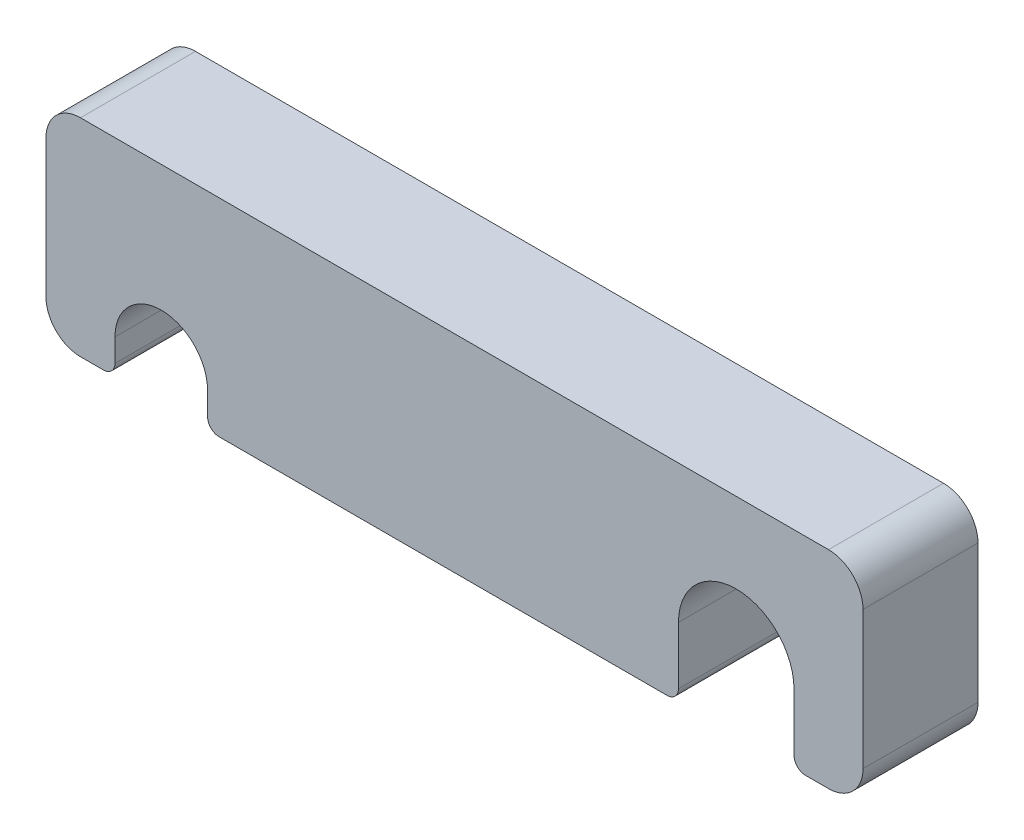
ISO-10303-21;
HEADER;
FILE_DESCRIPTION(('STEP AP214'),'2;1');
FILE_NAME('part.step','',(''),(''),'','','');
FILE_SCHEMA(('AUTOMOTIVE_DESIGN { 1 0 10303 214 1 1 1 1 }'));
ENDSEC;
DATA;
#1=APPLICATION_CONTEXT('core data for automotive mechanical design processes');
#2=APPLICATION_PROTOCOL_DEFINITION('international standard','automotive_design',2000,#1);
#3=PRODUCT_CONTEXT('',#1,'mechanical');
#4=PRODUCT('Part','Part','',(#3));
#5=PRODUCT_RELATED_PRODUCT_CATEGORY('part','',(#4));
#6=PRODUCT_DEFINITION_FORMATION('','',#4);
#7=PRODUCT_DEFINITION_CONTEXT('part definition',#1,'design');
#8=PRODUCT_DEFINITION('design','',#6,#7);
#9=PRODUCT_DEFINITION_SHAPE('','',#8);
#10=(LENGTH_UNIT() NAMED_UNIT(*) SI_UNIT(.MILLI.,.METRE.));
#11=(NAMED_UNIT(*) PLANE_ANGLE_UNIT() SI_UNIT($,.RADIAN.));
#12=(NAMED_UNIT(*) SI_UNIT($,.STERADIAN.) SOLID_ANGLE_UNIT());
#13=UNCERTAINTY_MEASURE_WITH_UNIT(LENGTH_MEASURE(1.E-05),#10,'distance_accuracy_value','');
#14=(GEOMETRIC_REPRESENTATION_CONTEXT(3) GLOBAL_UNCERTAINTY_ASSIGNED_CONTEXT((#13)) GLOBAL_UNIT_ASSIGNED_CONTEXT((#10,
#11,#12)) REPRESENTATION_CONTEXT('',''));
#15=CARTESIAN_POINT('',(0.,0.,0.));
#16=DIRECTION('',(0.,0.,1.));
#17=DIRECTION('',(1.,0.,0.));
#18=AXIS2_PLACEMENT_3D('',#15,#16,#17);
#19=CARTESIAN_POINT('',(68.05,3.00000000000001,10.));
#20=DIRECTION('',(0.,0.,-1.));
#21=DIRECTION('',(-1.,0.,0.));
#22=AXIS2_PLACEMENT_3D('',#19,#20,#21);
#23=CYLINDRICAL_SURFACE('',#22,3.);
#24=CARTESIAN_POINT('',(68.05,3.00000000000001,0.));
#25=DIRECTION('',(0.,0.,1.));
#26=DIRECTION('',(1.,0.,0.));
#27=AXIS2_PLACEMENT_3D('',#24,#25,#26);
#28=CIRCLE('',#27,3.);
#29=CARTESIAN_POINT('',(68.05,0.,0.));
#30=VERTEX_POINT('',#29);
#31=CARTESIAN_POINT('',(71.05,3.00000000000003,0.));
#32=VERTEX_POINT('',#31);
#33=EDGE_CURVE('E201',#30,#32,#28,.T.);
#34=ORIENTED_EDGE('',*,*,#33,.T.);
#35=DIRECTION('',(0.,0.,-1.));
#36=VECTOR('',#35,1.);
#37=CARTESIAN_POINT('',(71.05,3.00000000000003,10.));
#38=LINE('',#37,#36);
#39=CARTESIAN_POINT('',(71.05,3.00000000000003,10.));
#40=VERTEX_POINT('',#39);
#41=EDGE_CURVE('E11',#40,#32,#38,.T.);
#42=ORIENTED_EDGE('',*,*,#41,.F.);
#43=CARTESIAN_POINT('',(68.05,3.00000000000001,10.));
#44=DIRECTION('',(0.,0.,1.));
#45=DIRECTION('',(1.,0.,0.));
#46=AXIS2_PLACEMENT_3D('',#43,#44,#45);
#47=CIRCLE('',#46,3.);
#48=CARTESIAN_POINT('',(68.05,0.,10.));
#49=VERTEX_POINT('',#48);
#50=EDGE_CURVE('E239',#49,#40,#47,.T.);
#51=ORIENTED_EDGE('',*,*,#50,.F.);
#52=DIRECTION('',(0.,0.,-1.));
#53=VECTOR('',#52,1.);
#54=CARTESIAN_POINT('',(68.05,0.,10.));
#55=LINE('',#54,#53);
#56=EDGE_CURVE('E197',#49,#30,#55,.T.);
#57=ORIENTED_EDGE('',*,*,#56,.T.);
#58=EDGE_LOOP('',(#34,#42,#51,#57));
#59=FACE_BOUND('',#58,.T.);
#60=ADVANCED_FACE('F33',(#59),#23,.T.);
#61=CARTESIAN_POINT('',(71.05,15.,10.));
#62=DIRECTION('',(-1.,0.,0.));
#63=DIRECTION('',(0.,0.,1.));
#64=AXIS2_PLACEMENT_3D('',#61,#62,#63);
#65=PLANE('',#64);
#66=DIRECTION('',(0.,1.,0.));
#67=VECTOR('',#66,1.);
#68=CARTESIAN_POINT('',(71.05,15.,0.));
#69=LINE('',#68,#67);
#70=CARTESIAN_POINT('',(71.05,15.,0.));
#71=VERTEX_POINT('',#70);
#72=EDGE_CURVE('E204',#32,#71,#69,.T.);
#73=ORIENTED_EDGE('',*,*,#72,.T.);
#74=DIRECTION('',(0.,0.,-1.));
#75=VECTOR('',#74,1.);
#76=CARTESIAN_POINT('',(71.05,15.,10.));
#77=LINE('',#76,#75);
#78=CARTESIAN_POINT('',(71.05,15.,10.));
#79=VERTEX_POINT('',#78);
#80=EDGE_CURVE('E41',#79,#71,#77,.T.);
#81=ORIENTED_EDGE('',*,*,#80,.F.);
#82=DIRECTION('',(0.,1.,0.));
#83=VECTOR('',#82,1.);
#84=CARTESIAN_POINT('',(71.05,15.,10.));
#85=LINE('',#84,#83);
#86=EDGE_CURVE('E128',#40,#79,#85,.T.);
#87=ORIENTED_EDGE('',*,*,#86,.F.);
#88=ORIENTED_EDGE('',*,*,#41,.T.);
#89=EDGE_LOOP('',(#73,#81,#87,#88));
#90=FACE_BOUND('',#89,.T.);
#91=ADVANCED_FACE('F357',(#90),#65,.F.);
#92=CARTESIAN_POINT('',(68.05,15.,10.));
#93=DIRECTION('',(0.,0.,-1.));
#94=DIRECTION('',(-1.,0.,0.));
#95=AXIS2_PLACEMENT_3D('',#92,#93,#94);
#96=CYLINDRICAL_SURFACE('',#95,3.);
#97=CARTESIAN_POINT('',(68.05,15.,0.));
#98=DIRECTION('',(0.,0.,1.));
#99=DIRECTION('',(1.,0.,0.));
#100=AXIS2_PLACEMENT_3D('',#97,#98,#99);
#101=CIRCLE('',#100,3.);
#102=CARTESIAN_POINT('',(68.05,18.,0.));
#103=VERTEX_POINT('',#102);
#104=EDGE_CURVE('E206',#71,#103,#101,.T.);
#105=ORIENTED_EDGE('',*,*,#104,.T.);
#106=DIRECTION('',(0.,0.,-1.));
#107=VECTOR('',#106,1.);
#108=CARTESIAN_POINT('',(68.05,18.,10.));
#109=LINE('',#108,#107);
#110=CARTESIAN_POINT('',(68.05,18.,10.));
#111=VERTEX_POINT('',#110);
#112=EDGE_CURVE('E282',#111,#103,#109,.T.);
#113=ORIENTED_EDGE('',*,*,#112,.F.);
#114=CARTESIAN_POINT('',(68.05,15.,10.));
#115=DIRECTION('',(0.,0.,1.));
#116=DIRECTION('',(1.,0.,0.));
#117=AXIS2_PLACEMENT_3D('',#114,#115,#116);
#118=CIRCLE('',#117,3.);
#119=EDGE_CURVE('E290',#79,#111,#118,.T.);
#120=ORIENTED_EDGE('',*,*,#119,.F.);
#121=ORIENTED_EDGE('',*,*,#80,.T.);
#122=EDGE_LOOP('',(#105,#113,#120,#121));
#123=FACE_BOUND('',#122,.T.);
#124=ADVANCED_FACE('F288',(#123),#96,.T.);
#125=CARTESIAN_POINT('',(3.00000000000002,18.,10.));
#126=DIRECTION('',(0.,-1.,0.));
#127=DIRECTION('',(0.,0.,-1.));
#128=AXIS2_PLACEMENT_3D('',#125,#126,#127);
#129=PLANE('',#128);
#130=DIRECTION('',(-1.,0.,0.));
#131=VECTOR('',#130,1.);
#132=CARTESIAN_POINT('',(3.00000000000002,18.,0.));
#133=LINE('',#132,#131);
#134=CARTESIAN_POINT('',(3.00000000000002,18.,0.));
#135=VERTEX_POINT('',#134);
#136=EDGE_CURVE('E208',#103,#135,#133,.T.);
#137=ORIENTED_EDGE('',*,*,#136,.T.);
#138=DIRECTION('',(0.,0.,-1.));
#139=VECTOR('',#138,1.);
#140=CARTESIAN_POINT('',(3.00000000000002,18.,10.));
#141=LINE('',#140,#139);
#142=CARTESIAN_POINT('',(3.00000000000002,18.,10.));
#143=VERTEX_POINT('',#142);
#144=EDGE_CURVE('E279',#143,#135,#141,.T.);
#145=ORIENTED_EDGE('',*,*,#144,.F.);
#146=DIRECTION('',(-1.,0.,0.));
#147=VECTOR('',#146,1.);
#148=CARTESIAN_POINT('',(3.00000000000002,18.,10.));
#149=LINE('',#148,#147);
#150=EDGE_CURVE('E308',#111,#143,#149,.T.);
#151=ORIENTED_EDGE('',*,*,#150,.F.);
#152=ORIENTED_EDGE('',*,*,#112,.T.);
#153=EDGE_LOOP('',(#137,#145,#151,#152));
#154=FACE_BOUND('',#153,.T.);
#155=ADVANCED_FACE('F299',(#154),#129,.F.);
#156=CARTESIAN_POINT('',(3.,15.,10.));
#157=DIRECTION('',(0.,0.,-1.));
#158=DIRECTION('',(-1.,0.,0.));
#159=AXIS2_PLACEMENT_3D('',#156,#157,#158);
#160=CYLINDRICAL_SURFACE('',#159,3.);
#161=CARTESIAN_POINT('',(3.,15.,0.));
#162=DIRECTION('',(0.,0.,1.));
#163=DIRECTION('',(-1.,0.,0.));
#164=AXIS2_PLACEMENT_3D('',#161,#162,#163);
#165=CIRCLE('',#164,3.);
#166=CARTESIAN_POINT('',(0.,15.,0.));
#167=VERTEX_POINT('',#166);
#168=EDGE_CURVE('E210',#135,#167,#165,.T.);
#169=ORIENTED_EDGE('',*,*,#168,.T.);
#170=DIRECTION('',(0.,0.,-1.));
#171=VECTOR('',#170,1.);
#172=CARTESIAN_POINT('',(0.,15.,10.));
#173=LINE('',#172,#171);
#174=CARTESIAN_POINT('',(0.,15.,10.));
#175=VERTEX_POINT('',#174);
#176=EDGE_CURVE('E276',#175,#167,#173,.T.);
#177=ORIENTED_EDGE('',*,*,#176,.F.);
#178=CARTESIAN_POINT('',(3.,15.,10.));
#179=DIRECTION('',(0.,0.,1.));
#180=DIRECTION('',(-1.,0.,0.));
#181=AXIS2_PLACEMENT_3D('',#178,#179,#180);
#182=CIRCLE('',#181,3.);
#183=EDGE_CURVE('E305',#143,#175,#182,.T.);
#184=ORIENTED_EDGE('',*,*,#183,.F.);
#185=ORIENTED_EDGE('',*,*,#144,.T.);
#186=EDGE_LOOP('',(#169,#177,#184,#185));
#187=FACE_BOUND('',#186,.T.);
#188=ADVANCED_FACE('F303',(#187),#160,.T.);
#189=CARTESIAN_POINT('',(0.,3.00000000000002,10.));
#190=DIRECTION('',(1.,0.,0.));
#191=DIRECTION('',(0.,0.,-1.));
#192=AXIS2_PLACEMENT_3D('',#189,#190,#191);
#193=PLANE('',#192);
#194=DIRECTION('',(0.,-1.,0.));
#195=VECTOR('',#194,1.);
#196=CARTESIAN_POINT('',(0.,3.00000000000002,0.));
#197=LINE('',#196,#195);
#198=CARTESIAN_POINT('',(0.,3.00000000000002,0.));
#199=VERTEX_POINT('',#198);
#200=EDGE_CURVE('E212',#167,#199,#197,.T.);
#201=ORIENTED_EDGE('',*,*,#200,.T.);
#202=DIRECTION('',(0.,0.,-1.));
#203=VECTOR('',#202,1.);
#204=CARTESIAN_POINT('',(0.,3.00000000000002,10.));
#205=LINE('',#204,#203);
#206=CARTESIAN_POINT('',(0.,3.00000000000002,10.));
#207=VERTEX_POINT('',#206);
#208=EDGE_CURVE('E273',#207,#199,#205,.T.);
#209=ORIENTED_EDGE('',*,*,#208,.F.);
#210=DIRECTION('',(0.,-1.,0.));
#211=VECTOR('',#210,1.);
#212=CARTESIAN_POINT('',(0.,3.00000000000002,10.));
#213=LINE('',#212,#211);
#214=EDGE_CURVE('E307',#175,#207,#213,.T.);
#215=ORIENTED_EDGE('',*,*,#214,.F.);
#216=ORIENTED_EDGE('',*,*,#176,.T.);
#217=EDGE_LOOP('',(#201,#209,#215,#216));
#218=FACE_BOUND('',#217,.T.);
#219=ADVANCED_FACE('F370',(#218),#193,.F.);
#220=CARTESIAN_POINT('',(3.,3.,10.));
#221=DIRECTION('',(0.,0.,-1.));
#222=DIRECTION('',(-1.,0.,0.));
#223=AXIS2_PLACEMENT_3D('',#220,#221,#222);
#224=CYLINDRICAL_SURFACE('',#223,3.);
#225=CARTESIAN_POINT('',(3.,3.,0.));
#226=DIRECTION('',(0.,0.,1.));
#227=DIRECTION('',(-1.,0.,0.));
#228=AXIS2_PLACEMENT_3D('',#225,#226,#227);
#229=CIRCLE('',#228,3.);
#230=CARTESIAN_POINT('',(3.00000000000002,0.,0.));
#231=VERTEX_POINT('',#230);
#232=EDGE_CURVE('E214',#199,#231,#229,.T.);
#233=ORIENTED_EDGE('',*,*,#232,.T.);
#234=DIRECTION('',(0.,0.,-1.));
#235=VECTOR('',#234,1.);
#236=CARTESIAN_POINT('',(3.00000000000002,0.,10.));
#237=LINE('',#236,#235);
#238=CARTESIAN_POINT('',(3.00000000000002,0.,10.));
#239=VERTEX_POINT('',#238);
#240=EDGE_CURVE('E270',#239,#231,#237,.T.);
#241=ORIENTED_EDGE('',*,*,#240,.F.);
#242=CARTESIAN_POINT('',(3.,3.,10.));
#243=DIRECTION('',(0.,0.,1.));
#244=DIRECTION('',(-1.,0.,0.));
#245=AXIS2_PLACEMENT_3D('',#242,#243,#244);
#246=CIRCLE('',#245,3.);
#247=EDGE_CURVE('E310',#207,#239,#246,.T.);
#248=ORIENTED_EDGE('',*,*,#247,.F.);
#249=ORIENTED_EDGE('',*,*,#208,.T.);
#250=EDGE_LOOP('',(#233,#241,#248,#249));
#251=FACE_BOUND('',#250,.T.);
#252=ADVANCED_FACE('F373',(#251),#224,.T.);
#253=CARTESIAN_POINT('',(4.99999999999999,0.,10.));
#254=DIRECTION('',(0.,1.,0.));
#255=DIRECTION('',(-1.,0.,0.));
#256=AXIS2_PLACEMENT_3D('',#253,#254,#255);
#257=PLANE('',#256);
#258=DIRECTION('',(1.,0.,0.));
#259=VECTOR('',#258,1.);
#260=CARTESIAN_POINT('',(4.99999999999999,0.,0.));
#261=LINE('',#260,#259);
#262=CARTESIAN_POINT('',(4.99999999999999,0.,0.));
#263=VERTEX_POINT('',#262);
#264=EDGE_CURVE('E216',#231,#263,#261,.T.);
#265=ORIENTED_EDGE('',*,*,#264,.T.);
#266=DIRECTION('',(0.,0.,-1.));
#267=VECTOR('',#266,1.);
#268=CARTESIAN_POINT('',(4.99999999999999,0.,10.));
#269=LINE('',#268,#267);
#270=CARTESIAN_POINT('',(4.99999999999999,0.,10.));
#271=VERTEX_POINT('',#270);
#272=EDGE_CURVE('E267',#271,#263,#269,.T.);
#273=ORIENTED_EDGE('',*,*,#272,.F.);
#274=DIRECTION('',(1.,0.,0.));
#275=VECTOR('',#274,1.);
#276=CARTESIAN_POINT('',(4.99999999999999,0.,10.));
#277=LINE('',#276,#275);
#278=EDGE_CURVE('E316',#239,#271,#277,.T.);
#279=ORIENTED_EDGE('',*,*,#278,.F.);
#280=ORIENTED_EDGE('',*,*,#240,.T.);
#281=EDGE_LOOP('',(#265,#273,#279,#280));
#282=FACE_BOUND('',#281,.T.);
#283=ADVANCED_FACE('F377',(#282),#257,.F.);
#284=CARTESIAN_POINT('',(5.,1.,10.));
#285=DIRECTION('',(0.,0.,-1.));
#286=DIRECTION('',(-1.,0.,0.));
#287=AXIS2_PLACEMENT_3D('',#284,#285,#286);
#288=CYLINDRICAL_SURFACE('',#287,1.);
#289=CARTESIAN_POINT('',(5.,1.,0.));
#290=DIRECTION('',(0.,0.,1.));
#291=DIRECTION('',(1.,0.,0.));
#292=AXIS2_PLACEMENT_3D('',#289,#290,#291);
#293=CIRCLE('',#292,1.);
#294=CARTESIAN_POINT('',(6.,1.00000000000001,0.));
#295=VERTEX_POINT('',#294);
#296=EDGE_CURVE('E218',#263,#295,#293,.T.);
#297=ORIENTED_EDGE('',*,*,#296,.T.);
#298=DIRECTION('',(0.,0.,-1.));
#299=VECTOR('',#298,1.);
#300=CARTESIAN_POINT('',(6.,1.00000000000001,10.));
#301=LINE('',#300,#299);
#302=CARTESIAN_POINT('',(6.,1.00000000000001,10.));
#303=VERTEX_POINT('',#302);
#304=EDGE_CURVE('E264',#303,#295,#301,.T.);
#305=ORIENTED_EDGE('',*,*,#304,.F.);
#306=CARTESIAN_POINT('',(5.,1.,10.));
#307=DIRECTION('',(0.,0.,1.));
#308=DIRECTION('',(1.,0.,0.));
#309=AXIS2_PLACEMENT_3D('',#306,#307,#308);
#310=CIRCLE('',#309,1.);
#311=EDGE_CURVE('E318',#271,#303,#310,.T.);
#312=ORIENTED_EDGE('',*,*,#311,.F.);
#313=ORIENTED_EDGE('',*,*,#272,.T.);
#314=EDGE_LOOP('',(#297,#305,#312,#313));
#315=FACE_BOUND('',#314,.T.);
#316=ADVANCED_FACE('F381',(#315),#288,.T.);
#317=CARTESIAN_POINT('',(6.,2.99999999999999,10.));
#318=DIRECTION('',(-1.,0.,0.));
#319=DIRECTION('',(0.,0.,1.));
#320=AXIS2_PLACEMENT_3D('',#317,#318,#319);
#321=PLANE('',#320);
#322=DIRECTION('',(0.,1.,0.));
#323=VECTOR('',#322,1.);
#324=CARTESIAN_POINT('',(6.,2.99999999999999,0.));
#325=LINE('',#324,#323);
#326=CARTESIAN_POINT('',(6.,2.99999999999999,0.));
#327=VERTEX_POINT('',#326);
#328=EDGE_CURVE('E220',#295,#327,#325,.T.);
#329=ORIENTED_EDGE('',*,*,#328,.T.);
#330=DIRECTION('',(0.,0.,-1.));
#331=VECTOR('',#330,1.);
#332=CARTESIAN_POINT('',(6.,2.99999999999999,10.));
#333=LINE('',#332,#331);
#334=CARTESIAN_POINT('',(6.,2.99999999999999,10.));
#335=VERTEX_POINT('',#334);
#336=EDGE_CURVE('E261',#335,#327,#333,.T.);
#337=ORIENTED_EDGE('',*,*,#336,.F.);
#338=DIRECTION('',(0.,1.,0.));
#339=VECTOR('',#338,1.);
#340=CARTESIAN_POINT('',(6.,2.99999999999999,10.));
#341=LINE('',#340,#339);
#342=EDGE_CURVE('E320',#303,#335,#341,.T.);
#343=ORIENTED_EDGE('',*,*,#342,.F.);
#344=ORIENTED_EDGE('',*,*,#304,.T.);
#345=EDGE_LOOP('',(#329,#337,#343,#344));
#346=FACE_BOUND('',#345,.T.);
#347=ADVANCED_FACE('F385',(#346),#321,.F.);
#348=CARTESIAN_POINT('',(10.025,2.99999999999999,10.));
#349=DIRECTION('',(0.,0.,-1.));
#350=DIRECTION('',(-1.,0.,0.));
#351=AXIS2_PLACEMENT_3D('',#348,#349,#350);
#352=CYLINDRICAL_SURFACE('',#351,4.025);
#353=CARTESIAN_POINT('',(10.025,2.99999999999999,0.));
#354=DIRECTION('',(0.,0.,-1.));
#355=DIRECTION('',(1.,0.,0.));
#356=AXIS2_PLACEMENT_3D('',#353,#354,#355);
#357=CIRCLE('',#356,4.025);
#358=CARTESIAN_POINT('',(14.05,2.99999999999999,0.));
#359=VERTEX_POINT('',#358);
#360=EDGE_CURVE('E222',#327,#359,#357,.T.);
#361=ORIENTED_EDGE('',*,*,#360,.T.);
#362=DIRECTION('',(0.,0.,-1.));
#363=VECTOR('',#362,1.);
#364=CARTESIAN_POINT('',(14.05,2.99999999999999,10.));
#365=LINE('',#364,#363);
#366=CARTESIAN_POINT('',(14.05,2.99999999999999,10.));
#367=VERTEX_POINT('',#366);
#368=EDGE_CURVE('E258',#367,#359,#365,.T.);
#369=ORIENTED_EDGE('',*,*,#368,.F.);
#370=CARTESIAN_POINT('',(10.025,2.99999999999999,10.));
#371=DIRECTION('',(0.,0.,-1.));
#372=DIRECTION('',(1.,0.,0.));
#373=AXIS2_PLACEMENT_3D('',#370,#371,#372);
#374=CIRCLE('',#373,4.025);
#375=EDGE_CURVE('E322',#335,#367,#374,.T.);
#376=ORIENTED_EDGE('',*,*,#375,.F.);
#377=ORIENTED_EDGE('',*,*,#336,.T.);
#378=EDGE_LOOP('',(#361,#369,#376,#377));
#379=FACE_BOUND('',#378,.T.);
#380=ADVANCED_FACE('F389',(#379),#352,.F.);
#381=CARTESIAN_POINT('',(14.05,0.999999999999996,10.));
#382=DIRECTION('',(1.,0.,0.));
#383=DIRECTION('',(0.,0.,-1.));
#384=AXIS2_PLACEMENT_3D('',#381,#382,#383);
#385=PLANE('',#384);
#386=DIRECTION('',(0.,-1.,0.));
#387=VECTOR('',#386,1.);
#388=CARTESIAN_POINT('',(14.05,0.999999999999996,0.));
#389=LINE('',#388,#387);
#390=CARTESIAN_POINT('',(14.05,0.999999999999996,0.));
#391=VERTEX_POINT('',#390);
#392=EDGE_CURVE('E224',#359,#391,#389,.T.);
#393=ORIENTED_EDGE('',*,*,#392,.T.);
#394=DIRECTION('',(0.,0.,-1.));
#395=VECTOR('',#394,1.);
#396=CARTESIAN_POINT('',(14.05,0.999999999999996,10.));
#397=LINE('',#396,#395);
#398=CARTESIAN_POINT('',(14.05,0.999999999999996,10.));
#399=VERTEX_POINT('',#398);
#400=EDGE_CURVE('E255',#399,#391,#397,.T.);
#401=ORIENTED_EDGE('',*,*,#400,.F.);
#402=DIRECTION('',(0.,-1.,0.));
#403=VECTOR('',#402,1.);
#404=CARTESIAN_POINT('',(14.05,0.999999999999996,10.));
#405=LINE('',#404,#403);
#406=EDGE_CURVE('E324',#367,#399,#405,.T.);
#407=ORIENTED_EDGE('',*,*,#406,.F.);
#408=ORIENTED_EDGE('',*,*,#368,.T.);
#409=EDGE_LOOP('',(#393,#401,#407,#408));
#410=FACE_BOUND('',#409,.T.);
#411=ADVANCED_FACE('F393',(#410),#385,.F.);
#412=CARTESIAN_POINT('',(15.05,0.999999999999989,10.));
#413=DIRECTION('',(0.,0.,-1.));
#414=DIRECTION('',(-1.,0.,0.));
#415=AXIS2_PLACEMENT_3D('',#412,#413,#414);
#416=CYLINDRICAL_SURFACE('',#415,1.);
#417=CARTESIAN_POINT('',(15.05,0.999999999999989,0.));
#418=DIRECTION('',(0.,0.,1.));
#419=DIRECTION('',(-1.,0.,0.));
#420=AXIS2_PLACEMENT_3D('',#417,#418,#419);
#421=CIRCLE('',#420,1.);
#422=CARTESIAN_POINT('',(15.05,0.,0.));
#423=VERTEX_POINT('',#422);
#424=EDGE_CURVE('E226',#391,#423,#421,.T.);
#425=ORIENTED_EDGE('',*,*,#424,.T.);
#426=DIRECTION('',(0.,0.,-1.));
#427=VECTOR('',#426,1.);
#428=CARTESIAN_POINT('',(15.05,0.,10.));
#429=LINE('',#428,#427);
#430=CARTESIAN_POINT('',(15.05,0.,10.));
#431=VERTEX_POINT('',#430);
#432=EDGE_CURVE('E252',#431,#423,#429,.T.);
#433=ORIENTED_EDGE('',*,*,#432,.F.);
#434=CARTESIAN_POINT('',(15.05,0.999999999999989,10.));
#435=DIRECTION('',(0.,0.,1.));
#436=DIRECTION('',(-1.,0.,0.));
#437=AXIS2_PLACEMENT_3D('',#434,#435,#436);
#438=CIRCLE('',#437,1.);
#439=EDGE_CURVE('E326',#399,#431,#438,.T.);
#440=ORIENTED_EDGE('',*,*,#439,.F.);
#441=ORIENTED_EDGE('',*,*,#400,.T.);
#442=EDGE_LOOP('',(#425,#433,#440,#441));
#443=FACE_BOUND('',#442,.T.);
#444=ADVANCED_FACE('F397',(#443),#416,.T.);
#445=CARTESIAN_POINT('',(54.,0.,10.));
#446=DIRECTION('',(0.,1.,0.));
#447=DIRECTION('',(-1.,0.,0.));
#448=AXIS2_PLACEMENT_3D('',#445,#446,#447);
#449=PLANE('',#448);
#450=DIRECTION('',(1.,0.,0.));
#451=VECTOR('',#450,1.);
#452=CARTESIAN_POINT('',(54.,0.,0.));
#453=LINE('',#452,#451);
#454=CARTESIAN_POINT('',(54.,0.,0.));
#455=VERTEX_POINT('',#454);
#456=EDGE_CURVE('E228',#423,#455,#453,.T.);
#457=ORIENTED_EDGE('',*,*,#456,.T.);
#458=DIRECTION('',(0.,0.,-1.));
#459=VECTOR('',#458,1.);
#460=CARTESIAN_POINT('',(54.,0.,10.));
#461=LINE('',#460,#459);
#462=CARTESIAN_POINT('',(54.,0.,10.));
#463=VERTEX_POINT('',#462);
#464=EDGE_CURVE('E249',#463,#455,#461,.T.);
#465=ORIENTED_EDGE('',*,*,#464,.F.);
#466=DIRECTION('',(1.,0.,0.));
#467=VECTOR('',#466,1.);
#468=CARTESIAN_POINT('',(54.,0.,10.));
#469=LINE('',#468,#467);
#470=EDGE_CURVE('E328',#431,#463,#469,.T.);
#471=ORIENTED_EDGE('',*,*,#470,.F.);
#472=ORIENTED_EDGE('',*,*,#432,.T.);
#473=EDGE_LOOP('',(#457,#465,#471,#472));
#474=FACE_BOUND('',#473,.T.);
#475=ADVANCED_FACE('F401',(#474),#449,.F.);
#476=CARTESIAN_POINT('',(54.,1.00000000000001,10.));
#477=DIRECTION('',(0.,0.,-1.));
#478=DIRECTION('',(-1.,0.,0.));
#479=AXIS2_PLACEMENT_3D('',#476,#477,#478);
#480=CYLINDRICAL_SURFACE('',#479,1.);
#481=CARTESIAN_POINT('',(54.,1.00000000000001,0.));
#482=DIRECTION('',(0.,0.,1.));
#483=DIRECTION('',(1.,0.,0.));
#484=AXIS2_PLACEMENT_3D('',#481,#482,#483);
#485=CIRCLE('',#484,1.);
#486=CARTESIAN_POINT('',(55.,1.00000000000002,0.));
#487=VERTEX_POINT('',#486);
#488=EDGE_CURVE('E230',#455,#487,#485,.T.);
#489=ORIENTED_EDGE('',*,*,#488,.T.);
#490=DIRECTION('',(0.,0.,-1.));
#491=VECTOR('',#490,1.);
#492=CARTESIAN_POINT('',(55.,1.00000000000002,10.));
#493=LINE('',#492,#491);
#494=CARTESIAN_POINT('',(55.,1.00000000000002,10.));
#495=VERTEX_POINT('',#494);
#496=EDGE_CURVE('E246',#495,#487,#493,.T.);
#497=ORIENTED_EDGE('',*,*,#496,.F.);
#498=CARTESIAN_POINT('',(54.,1.00000000000001,10.));
#499=DIRECTION('',(0.,0.,1.));
#500=DIRECTION('',(1.,0.,0.));
#501=AXIS2_PLACEMENT_3D('',#498,#499,#500);
#502=CIRCLE('',#501,1.);
#503=EDGE_CURVE('E330',#463,#495,#502,.T.);
#504=ORIENTED_EDGE('',*,*,#503,.F.);
#505=ORIENTED_EDGE('',*,*,#464,.T.);
#506=EDGE_LOOP('',(#489,#497,#504,#505));
#507=FACE_BOUND('',#506,.T.);
#508=ADVANCED_FACE('F405',(#507),#480,.T.);
#509=CARTESIAN_POINT('',(55.,5.99999999999999,10.));
#510=DIRECTION('',(-1.,0.,0.));
#511=DIRECTION('',(0.,-1.,0.));
#512=AXIS2_PLACEMENT_3D('',#509,#510,#511);
#513=PLANE('',#512);
#514=DIRECTION('',(0.,1.,0.));
#515=VECTOR('',#514,1.);
#516=CARTESIAN_POINT('',(55.,5.99999999999999,0.));
#517=LINE('',#516,#515);
#518=CARTESIAN_POINT('',(55.,5.99999999999999,0.));
#519=VERTEX_POINT('',#518);
#520=EDGE_CURVE('E232',#487,#519,#517,.T.);
#521=ORIENTED_EDGE('',*,*,#520,.T.);
#522=DIRECTION('',(0.,0.,-1.));
#523=VECTOR('',#522,1.);
#524=CARTESIAN_POINT('',(55.,5.99999999999999,10.));
#525=LINE('',#524,#523);
#526=CARTESIAN_POINT('',(55.,5.99999999999999,10.));
#527=VERTEX_POINT('',#526);
#528=EDGE_CURVE('E243',#527,#519,#525,.T.);
#529=ORIENTED_EDGE('',*,*,#528,.F.);
#530=DIRECTION('',(0.,1.,0.));
#531=VECTOR('',#530,1.);
#532=CARTESIAN_POINT('',(55.,5.99999999999999,10.));
#533=LINE('',#532,#531);
#534=EDGE_CURVE('E332',#495,#527,#533,.T.);
#535=ORIENTED_EDGE('',*,*,#534,.F.);
#536=ORIENTED_EDGE('',*,*,#496,.T.);
#537=EDGE_LOOP('',(#521,#529,#535,#536));
#538=FACE_BOUND('',#537,.T.);
#539=ADVANCED_FACE('F338',(#538),#513,.F.);
#540=CARTESIAN_POINT('',(60.025,5.99999999999999,10.));
#541=DIRECTION('',(0.,0.,-1.));
#542=DIRECTION('',(-1.,0.,0.));
#543=AXIS2_PLACEMENT_3D('',#540,#541,#542);
#544=CYLINDRICAL_SURFACE('',#543,5.02500000000001);
#545=CARTESIAN_POINT('',(60.025,5.99999999999999,0.));
#546=DIRECTION('',(0.,0.,-1.));
#547=DIRECTION('',(1.,0.,0.));
#548=AXIS2_PLACEMENT_3D('',#545,#546,#547);
#549=CIRCLE('',#548,5.02500000000001);
#550=CARTESIAN_POINT('',(65.05,5.99999999999999,0.));
#551=VERTEX_POINT('',#550);
#552=EDGE_CURVE('E234',#519,#551,#549,.T.);
#553=ORIENTED_EDGE('',*,*,#552,.T.);
#554=DIRECTION('',(0.,0.,-1.));
#555=VECTOR('',#554,1.);
#556=CARTESIAN_POINT('',(65.05,5.99999999999999,10.));
#557=LINE('',#556,#555);
#558=CARTESIAN_POINT('',(65.05,5.99999999999999,10.));
#559=VERTEX_POINT('',#558);
#560=EDGE_CURVE('E192',#559,#551,#557,.T.);
#561=ORIENTED_EDGE('',*,*,#560,.F.);
#562=CARTESIAN_POINT('',(60.025,5.99999999999999,10.));
#563=DIRECTION('',(0.,0.,-1.));
#564=DIRECTION('',(1.,0.,0.));
#565=AXIS2_PLACEMENT_3D('',#562,#563,#564);
#566=CIRCLE('',#565,5.02500000000001);
#567=EDGE_CURVE('E183',#527,#559,#566,.T.);
#568=ORIENTED_EDGE('',*,*,#567,.F.);
#569=ORIENTED_EDGE('',*,*,#528,.T.);
#570=EDGE_LOOP('',(#553,#561,#568,#569));
#571=FACE_BOUND('',#570,.T.);
#572=ADVANCED_FACE('F342',(#571),#544,.F.);
#573=CARTESIAN_POINT('',(65.05,1.00000000000002,10.));
#574=DIRECTION('',(1.,0.,0.));
#575=DIRECTION('',(0.,1.,0.));
#576=AXIS2_PLACEMENT_3D('',#573,#574,#575);
#577=PLANE('',#576);
#578=DIRECTION('',(0.,-1.,0.));
#579=VECTOR('',#578,1.);
#580=CARTESIAN_POINT('',(65.05,1.00000000000002,0.));
#581=LINE('',#580,#579);
#582=CARTESIAN_POINT('',(65.05,1.00000000000002,0.));
#583=VERTEX_POINT('',#582);
#584=EDGE_CURVE('E191',#551,#583,#581,.T.);
#585=ORIENTED_EDGE('',*,*,#584,.T.);
#586=DIRECTION('',(0.,0.,-1.));
#587=VECTOR('',#586,1.);
#588=CARTESIAN_POINT('',(65.05,1.00000000000002,10.));
#589=LINE('',#588,#587);
#590=CARTESIAN_POINT('',(65.05,1.00000000000002,10.));
#591=VERTEX_POINT('',#590);
#592=EDGE_CURVE('E188',#591,#583,#589,.T.);
#593=ORIENTED_EDGE('',*,*,#592,.F.);
#594=DIRECTION('',(0.,-1.,0.));
#595=VECTOR('',#594,1.);
#596=CARTESIAN_POINT('',(65.05,1.00000000000002,10.));
#597=LINE('',#596,#595);
#598=EDGE_CURVE('E177',#559,#591,#597,.T.);
#599=ORIENTED_EDGE('',*,*,#598,.F.);
#600=ORIENTED_EDGE('',*,*,#560,.T.);
#601=EDGE_LOOP('',(#585,#593,#599,#600));
#602=FACE_BOUND('',#601,.T.);
#603=ADVANCED_FACE('F189',(#602),#577,.F.);
#604=CARTESIAN_POINT('',(66.05,1.00000000000001,10.));
#605=DIRECTION('',(0.,0.,-1.));
#606=DIRECTION('',(-1.,0.,0.));
#607=AXIS2_PLACEMENT_3D('',#604,#605,#606);
#608=CYLINDRICAL_SURFACE('',#607,1.);
#609=CARTESIAN_POINT('',(66.05,1.00000000000001,0.));
#610=DIRECTION('',(0.,0.,1.));
#611=DIRECTION('',(-1.,0.,0.));
#612=AXIS2_PLACEMENT_3D('',#609,#610,#611);
#613=CIRCLE('',#612,1.);
#614=CARTESIAN_POINT('',(66.05,0.,0.));
#615=VERTEX_POINT('',#614);
#616=EDGE_CURVE('E114',#583,#615,#613,.T.);
#617=ORIENTED_EDGE('',*,*,#616,.T.);
#618=DIRECTION('',(0.,0.,-1.));
#619=VECTOR('',#618,1.);
#620=CARTESIAN_POINT('',(66.05,0.,10.));
#621=LINE('',#620,#619);
#622=CARTESIAN_POINT('',(66.05,0.,10.));
#623=VERTEX_POINT('',#622);
#624=EDGE_CURVE('E193',#623,#615,#621,.T.);
#625=ORIENTED_EDGE('',*,*,#624,.F.);
#626=CARTESIAN_POINT('',(66.05,1.00000000000001,10.));
#627=DIRECTION('',(0.,0.,1.));
#628=DIRECTION('',(-1.,0.,0.));
#629=AXIS2_PLACEMENT_3D('',#626,#627,#628);
#630=CIRCLE('',#629,1.);
#631=EDGE_CURVE('E181',#591,#623,#630,.T.);
#632=ORIENTED_EDGE('',*,*,#631,.F.);
#633=ORIENTED_EDGE('',*,*,#592,.T.);
#634=EDGE_LOOP('',(#617,#625,#632,#633));
#635=FACE_BOUND('',#634,.T.);
#636=ADVANCED_FACE('F195',(#635),#608,.T.);
#637=CARTESIAN_POINT('',(68.05,0.,10.));
#638=DIRECTION('',(0.,1.,0.));
#639=DIRECTION('',(-1.,0.,0.));
#640=AXIS2_PLACEMENT_3D('',#637,#638,#639);
#641=PLANE('',#640);
#642=DIRECTION('',(1.,0.,0.));
#643=VECTOR('',#642,1.);
#644=CARTESIAN_POINT('',(68.05,0.,0.));
#645=LINE('',#644,#643);
#646=EDGE_CURVE('E120',#615,#30,#645,.T.);
#647=ORIENTED_EDGE('',*,*,#646,.T.);
#648=ORIENTED_EDGE('',*,*,#56,.F.);
#649=DIRECTION('',(1.,0.,0.));
#650=VECTOR('',#649,1.);
#651=CARTESIAN_POINT('',(68.05,0.,10.));
#652=LINE('',#651,#650);
#653=EDGE_CURVE('E49',#623,#49,#652,.T.);
#654=ORIENTED_EDGE('',*,*,#653,.F.);
#655=ORIENTED_EDGE('',*,*,#624,.T.);
#656=EDGE_LOOP('',(#647,#648,#654,#655));
#657=FACE_BOUND('',#656,.T.);
#658=ADVANCED_FACE('F346',(#657),#641,.F.);
#659=CARTESIAN_POINT('',(68.05,3.00000000000001,10.));
#660=DIRECTION('',(0.,0.,1.));
#661=DIRECTION('',(1.,0.,0.));
#662=AXIS2_PLACEMENT_3D('',#659,#660,#661);
#663=PLANE('',#662);
#664=ORIENTED_EDGE('',*,*,#50,.T.);
#665=ORIENTED_EDGE('',*,*,#86,.T.);
#666=ORIENTED_EDGE('',*,*,#119,.T.);
#667=ORIENTED_EDGE('',*,*,#150,.T.);
#668=ORIENTED_EDGE('',*,*,#183,.T.);
#669=ORIENTED_EDGE('',*,*,#214,.T.);
#670=ORIENTED_EDGE('',*,*,#247,.T.);
#671=ORIENTED_EDGE('',*,*,#278,.T.);
#672=ORIENTED_EDGE('',*,*,#311,.T.);
#673=ORIENTED_EDGE('',*,*,#342,.T.);
#674=ORIENTED_EDGE('',*,*,#375,.T.);
#675=ORIENTED_EDGE('',*,*,#406,.T.);
#676=ORIENTED_EDGE('',*,*,#439,.T.);
#677=ORIENTED_EDGE('',*,*,#470,.T.);
#678=ORIENTED_EDGE('',*,*,#503,.T.);
#679=ORIENTED_EDGE('',*,*,#534,.T.);
#680=ORIENTED_EDGE('',*,*,#567,.T.);
#681=ORIENTED_EDGE('',*,*,#598,.T.);
#682=ORIENTED_EDGE('',*,*,#631,.T.);
#683=ORIENTED_EDGE('',*,*,#653,.T.);
#684=EDGE_LOOP('',(#664,#665,#666,#667,#668,#669,#670,#671,#672,#673,#674,#675,#676,#677,#678,
#679,#680,#681,#682,#683));
#685=FACE_BOUND('',#684,.T.);
#686=ADVANCED_FACE('F179',(#685),#663,.T.);
#687=CARTESIAN_POINT('',(68.05,3.00000000000001,0.));
#688=DIRECTION('',(0.,0.,1.));
#689=DIRECTION('',(1.,0.,0.));
#690=AXIS2_PLACEMENT_3D('',#687,#688,#689);
#691=PLANE('',#690);
#692=ORIENTED_EDGE('',*,*,#33,.F.);
#693=ORIENTED_EDGE('',*,*,#646,.F.);
#694=ORIENTED_EDGE('',*,*,#616,.F.);
#695=ORIENTED_EDGE('',*,*,#584,.F.);
#696=ORIENTED_EDGE('',*,*,#552,.F.);
#697=ORIENTED_EDGE('',*,*,#520,.F.);
#698=ORIENTED_EDGE('',*,*,#488,.F.);
#699=ORIENTED_EDGE('',*,*,#456,.F.);
#700=ORIENTED_EDGE('',*,*,#424,.F.);
#701=ORIENTED_EDGE('',*,*,#392,.F.);
#702=ORIENTED_EDGE('',*,*,#360,.F.);
#703=ORIENTED_EDGE('',*,*,#328,.F.);
#704=ORIENTED_EDGE('',*,*,#296,.F.);
#705=ORIENTED_EDGE('',*,*,#264,.F.);
#706=ORIENTED_EDGE('',*,*,#232,.F.);
#707=ORIENTED_EDGE('',*,*,#200,.F.);
#708=ORIENTED_EDGE('',*,*,#168,.F.);
#709=ORIENTED_EDGE('',*,*,#136,.F.);
#710=ORIENTED_EDGE('',*,*,#104,.F.);
#711=ORIENTED_EDGE('',*,*,#72,.F.);
#712=EDGE_LOOP('',(#692,#693,#694,#695,#696,#697,#698,#699,#700,#701,#702,#703,#704,#705,#706,
#707,#708,#709,#710,#711));
#713=FACE_BOUND('',#712,.T.);
#714=ADVANCED_FACE('F294',(#713),#691,.F.);
#715=CLOSED_SHELL('',(#60,#91,#124,#155,#188,#219,#252,#283,#316,#347,#380,#411,#444,#475,#508,
#539,#572,#603,#636,#658,#686,#714));
#716=MANIFOLD_SOLID_BREP('B2',#715);
#717=ADVANCED_BREP_SHAPE_REPRESENTATION('',(#18,#716),#14);
#718=SHAPE_DEFINITION_REPRESENTATION(#9,#717);
ENDSEC;
END-ISO-10303-21;
